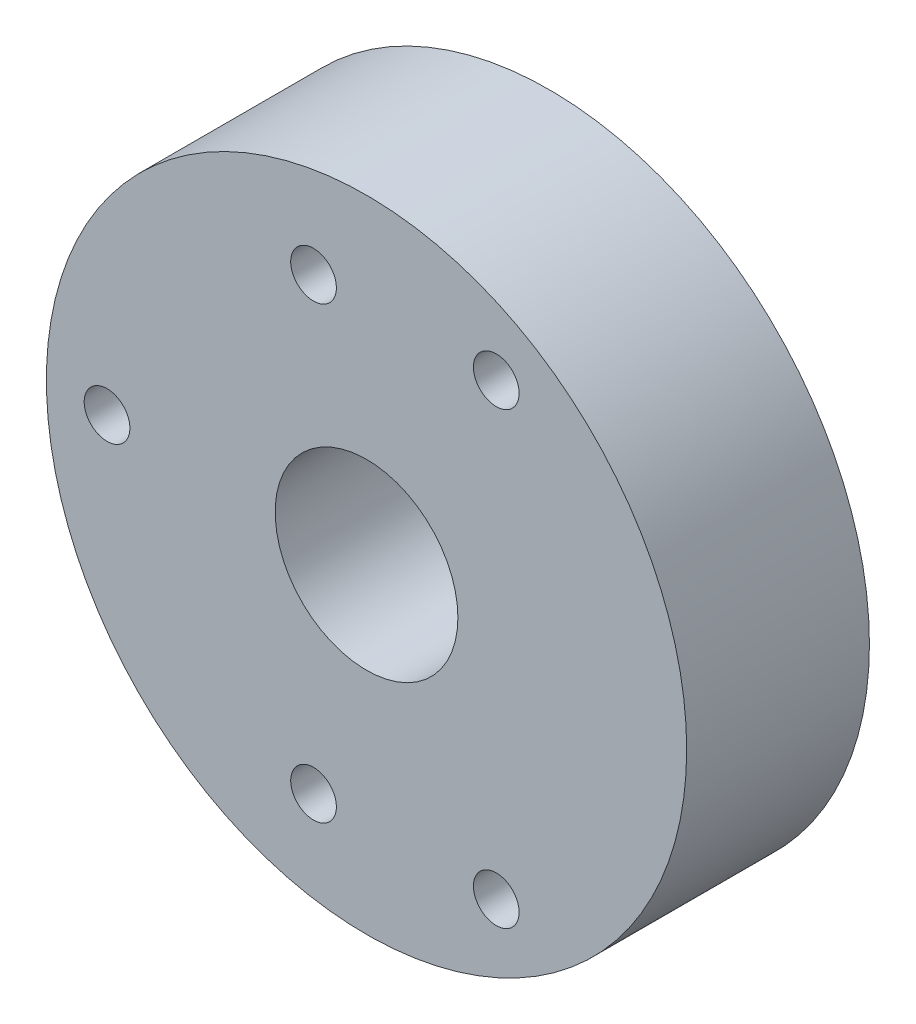
ISO-10303-21;
HEADER;
FILE_DESCRIPTION(('STEP AP214'),'2;1');
FILE_NAME('part.step','',(''),(''),'','','');
FILE_SCHEMA(('AUTOMOTIVE_DESIGN { 1 0 10303 214 1 1 1 1 }'));
ENDSEC;
DATA;
#1=APPLICATION_CONTEXT('core data for automotive mechanical design processes');
#2=APPLICATION_PROTOCOL_DEFINITION('international standard','automotive_design',2000,#1);
#3=PRODUCT_CONTEXT('',#1,'mechanical');
#4=PRODUCT('Part','Part','',(#3));
#5=PRODUCT_RELATED_PRODUCT_CATEGORY('part','',(#4));
#6=PRODUCT_DEFINITION_FORMATION('','',#4);
#7=PRODUCT_DEFINITION_CONTEXT('part definition',#1,'design');
#8=PRODUCT_DEFINITION('design','',#6,#7);
#9=PRODUCT_DEFINITION_SHAPE('','',#8);
#10=(LENGTH_UNIT() NAMED_UNIT(*) SI_UNIT(.MILLI.,.METRE.));
#11=(NAMED_UNIT(*) PLANE_ANGLE_UNIT() SI_UNIT($,.RADIAN.));
#12=(NAMED_UNIT(*) SI_UNIT($,.STERADIAN.) SOLID_ANGLE_UNIT());
#13=UNCERTAINTY_MEASURE_WITH_UNIT(LENGTH_MEASURE(1.E-05),#10,'distance_accuracy_value','');
#14=(GEOMETRIC_REPRESENTATION_CONTEXT(3) GLOBAL_UNCERTAINTY_ASSIGNED_CONTEXT((#13)) GLOBAL_UNIT_ASSIGNED_CONTEXT((#10,
#11,#12)) REPRESENTATION_CONTEXT('',''));
#15=CARTESIAN_POINT('',(0.,0.,0.));
#16=DIRECTION('',(0.,0.,1.));
#17=DIRECTION('',(1.,0.,0.));
#18=AXIS2_PLACEMENT_3D('',#15,#16,#17);
#19=CARTESIAN_POINT('',(0.,0.,25.4));
#20=DIRECTION('',(0.,0.,1.));
#21=DIRECTION('',(1.,0.,0.));
#22=AXIS2_PLACEMENT_3D('',#19,#20,#21);
#23=PLANE('',#22);
#24=CARTESIAN_POINT('',(-7.36599999999985,-31.235804263697,25.4));
#25=DIRECTION('',(0.,0.,1.));
#26=DIRECTION('',(1.,0.,0.));
#27=AXIS2_PLACEMENT_3D('',#24,#25,#26);
#28=CIRCLE('',#27,3.175);
#29=CARTESIAN_POINT('',(-4.19099999999985,-31.235804263697,25.4));
#30=VERTEX_POINT('',#29);
#31=EDGE_CURVE('E92',#30,#30,#28,.T.);
#32=ORIENTED_EDGE('',*,*,#31,.F.);
#33=EDGE_LOOP('',(#32));
#34=FACE_BOUND('',#33,.T.);
#35=CARTESIAN_POINT('',(-7.36599999999985,31.2358042636972,25.4));
#36=DIRECTION('',(0.,0.,1.));
#37=DIRECTION('',(1.,0.,0.));
#38=AXIS2_PLACEMENT_3D('',#35,#36,#37);
#39=CIRCLE('',#38,3.175);
#40=CARTESIAN_POINT('',(-4.19099999999985,31.2358042636972,25.4));
#41=VERTEX_POINT('',#40);
#42=EDGE_CURVE('E84',#41,#41,#39,.T.);
#43=ORIENTED_EDGE('',*,*,#42,.F.);
#44=EDGE_LOOP('',(#43));
#45=FACE_BOUND('',#44,.T.);
#46=CARTESIAN_POINT('',(18.0339999999997,31.2358042636973,25.4));
#47=DIRECTION('',(0.,0.,1.));
#48=DIRECTION('',(1.,0.,0.));
#49=AXIS2_PLACEMENT_3D('',#46,#47,#48);
#50=CIRCLE('',#49,3.175);
#51=CARTESIAN_POINT('',(21.2089999999997,31.2358042636973,25.4));
#52=VERTEX_POINT('',#51);
#53=EDGE_CURVE('E64',#52,#52,#50,.T.);
#54=ORIENTED_EDGE('',*,*,#53,.F.);
#55=EDGE_LOOP('',(#54));
#56=FACE_BOUND('',#55,.T.);
#57=CARTESIAN_POINT('',(0.,0.,25.4));
#58=DIRECTION('',(0.,0.,1.));
#59=DIRECTION('',(1.,0.,0.));
#60=AXIS2_PLACEMENT_3D('',#57,#58,#59);
#61=CIRCLE('',#60,12.7);
#62=CARTESIAN_POINT('',(12.7,0.,25.4));
#63=VERTEX_POINT('',#62);
#64=EDGE_CURVE('E50',#63,#63,#61,.T.);
#65=ORIENTED_EDGE('',*,*,#64,.F.);
#66=EDGE_LOOP('',(#65));
#67=FACE_BOUND('',#66,.T.);
#68=CARTESIAN_POINT('',(0.,0.,25.4));
#69=DIRECTION('',(0.,0.,1.));
#70=DIRECTION('',(1.,0.,0.));
#71=AXIS2_PLACEMENT_3D('',#68,#69,#70);
#72=CIRCLE('',#71,44.5002622140085);
#73=CARTESIAN_POINT('',(44.5002622140085,0.,25.4));
#74=VERTEX_POINT('',#73);
#75=EDGE_CURVE('E10',#74,#74,#72,.T.);
#76=ORIENTED_EDGE('',*,*,#75,.T.);
#77=EDGE_LOOP('',(#76));
#78=FACE_BOUND('',#77,.T.);
#79=CARTESIAN_POINT('',(-36.068,0.,25.4));
#80=DIRECTION('',(0.,0.,1.));
#81=DIRECTION('',(1.,0.,0.));
#82=AXIS2_PLACEMENT_3D('',#79,#80,#81);
#83=CIRCLE('',#82,3.175);
#84=CARTESIAN_POINT('',(-32.893,0.,25.4));
#85=VERTEX_POINT('',#84);
#86=EDGE_CURVE('E56',#85,#85,#83,.T.);
#87=ORIENTED_EDGE('',*,*,#86,.F.);
#88=EDGE_LOOP('',(#87));
#89=FACE_BOUND('',#88,.T.);
#90=CARTESIAN_POINT('',(18.0340000000001,-31.235804263697,25.4));
#91=DIRECTION('',(0.,0.,1.));
#92=DIRECTION('',(1.,0.,0.));
#93=AXIS2_PLACEMENT_3D('',#90,#91,#92);
#94=CIRCLE('',#93,3.175);
#95=CARTESIAN_POINT('',(21.2090000000001,-31.235804263697,25.4));
#96=VERTEX_POINT('',#95);
#97=EDGE_CURVE('E72',#96,#96,#94,.T.);
#98=ORIENTED_EDGE('',*,*,#97,.F.);
#99=EDGE_LOOP('',(#98));
#100=FACE_BOUND('',#99,.T.);
#101=ADVANCED_FACE('F37',(#34,#45,#56,#67,#78,#89,#100),#23,.T.);
#102=CARTESIAN_POINT('',(0.,0.,0.));
#103=DIRECTION('',(0.,0.,1.));
#104=DIRECTION('',(1.,0.,0.));
#105=AXIS2_PLACEMENT_3D('',#102,#103,#104);
#106=PLANE('',#105);
#107=CARTESIAN_POINT('',(-7.36599999999985,-31.235804263697,0.));
#108=DIRECTION('',(0.,0.,1.));
#109=DIRECTION('',(1.,0.,0.));
#110=AXIS2_PLACEMENT_3D('',#107,#108,#109);
#111=CIRCLE('',#110,3.175);
#112=CARTESIAN_POINT('',(-4.19099999999985,-31.235804263697,0.));
#113=VERTEX_POINT('',#112);
#114=EDGE_CURVE('E80',#113,#113,#111,.T.);
#115=ORIENTED_EDGE('',*,*,#114,.T.);
#116=EDGE_LOOP('',(#115));
#117=FACE_BOUND('',#116,.T.);
#118=CARTESIAN_POINT('',(-7.36599999999985,31.2358042636972,0.));
#119=DIRECTION('',(0.,0.,1.));
#120=DIRECTION('',(1.,0.,0.));
#121=AXIS2_PLACEMENT_3D('',#118,#119,#120);
#122=CIRCLE('',#121,3.175);
#123=CARTESIAN_POINT('',(-4.19099999999985,31.2358042636972,0.));
#124=VERTEX_POINT('',#123);
#125=EDGE_CURVE('E88',#124,#124,#122,.T.);
#126=ORIENTED_EDGE('',*,*,#125,.T.);
#127=EDGE_LOOP('',(#126));
#128=FACE_BOUND('',#127,.T.);
#129=CARTESIAN_POINT('',(0.,0.,0.));
#130=DIRECTION('',(0.,0.,1.));
#131=DIRECTION('',(1.,0.,0.));
#132=AXIS2_PLACEMENT_3D('',#129,#130,#131);
#133=CIRCLE('',#132,44.5002622140085);
#134=CARTESIAN_POINT('',(44.5002622140085,0.,0.));
#135=VERTEX_POINT('',#134);
#136=EDGE_CURVE('E41',#135,#135,#133,.T.);
#137=ORIENTED_EDGE('',*,*,#136,.F.);
#138=EDGE_LOOP('',(#137));
#139=FACE_BOUND('',#138,.T.);
#140=CARTESIAN_POINT('',(0.,0.,0.));
#141=DIRECTION('',(0.,0.,1.));
#142=DIRECTION('',(1.,0.,0.));
#143=AXIS2_PLACEMENT_3D('',#140,#141,#142);
#144=CIRCLE('',#143,12.7);
#145=CARTESIAN_POINT('',(12.7,0.,0.));
#146=VERTEX_POINT('',#145);
#147=EDGE_CURVE('E52',#146,#146,#144,.T.);
#148=ORIENTED_EDGE('',*,*,#147,.T.);
#149=EDGE_LOOP('',(#148));
#150=FACE_BOUND('',#149,.T.);
#151=CARTESIAN_POINT('',(-36.068,0.,0.));
#152=DIRECTION('',(0.,0.,1.));
#153=DIRECTION('',(1.,0.,0.));
#154=AXIS2_PLACEMENT_3D('',#151,#152,#153);
#155=CIRCLE('',#154,3.175);
#156=CARTESIAN_POINT('',(-32.893,0.,0.));
#157=VERTEX_POINT('',#156);
#158=EDGE_CURVE('E60',#157,#157,#155,.T.);
#159=ORIENTED_EDGE('',*,*,#158,.T.);
#160=EDGE_LOOP('',(#159));
#161=FACE_BOUND('',#160,.T.);
#162=CARTESIAN_POINT('',(18.0339999999997,31.2358042636973,0.));
#163=DIRECTION('',(0.,0.,1.));
#164=DIRECTION('',(1.,0.,0.));
#165=AXIS2_PLACEMENT_3D('',#162,#163,#164);
#166=CIRCLE('',#165,3.175);
#167=CARTESIAN_POINT('',(21.2089999999997,31.2358042636973,0.));
#168=VERTEX_POINT('',#167);
#169=EDGE_CURVE('E68',#168,#168,#166,.T.);
#170=ORIENTED_EDGE('',*,*,#169,.T.);
#171=EDGE_LOOP('',(#170));
#172=FACE_BOUND('',#171,.T.);
#173=CARTESIAN_POINT('',(18.0340000000001,-31.235804263697,0.));
#174=DIRECTION('',(0.,0.,1.));
#175=DIRECTION('',(1.,0.,0.));
#176=AXIS2_PLACEMENT_3D('',#173,#174,#175);
#177=CIRCLE('',#176,3.175);
#178=CARTESIAN_POINT('',(21.2090000000001,-31.235804263697,0.));
#179=VERTEX_POINT('',#178);
#180=EDGE_CURVE('E76',#179,#179,#177,.T.);
#181=ORIENTED_EDGE('',*,*,#180,.T.);
#182=EDGE_LOOP('',(#181));
#183=FACE_BOUND('',#182,.T.);
#184=ADVANCED_FACE('F100',(#117,#128,#139,#150,#161,#172,#183),#106,.F.);
#185=CARTESIAN_POINT('',(0.,0.,25.4));
#186=DIRECTION('',(0.,0.,-1.));
#187=DIRECTION('',(-1.,0.,0.));
#188=AXIS2_PLACEMENT_3D('',#185,#186,#187);
#189=CYLINDRICAL_SURFACE('',#188,44.5002622140085);
#190=ORIENTED_EDGE('',*,*,#75,.F.);
#191=EDGE_LOOP('',(#190));
#192=FACE_BOUND('',#191,.T.);
#193=ORIENTED_EDGE('',*,*,#136,.T.);
#194=EDGE_LOOP('',(#193));
#195=FACE_BOUND('',#194,.T.);
#196=ADVANCED_FACE('F39',(#192,#195),#189,.T.);
#197=CARTESIAN_POINT('',(0.,0.,25.4));
#198=DIRECTION('',(0.,0.,-1.));
#199=DIRECTION('',(-1.,0.,0.));
#200=AXIS2_PLACEMENT_3D('',#197,#198,#199);
#201=CYLINDRICAL_SURFACE('',#200,12.7);
#202=ORIENTED_EDGE('',*,*,#64,.T.);
#203=EDGE_LOOP('',(#202));
#204=FACE_BOUND('',#203,.T.);
#205=ORIENTED_EDGE('',*,*,#147,.F.);
#206=EDGE_LOOP('',(#205));
#207=FACE_BOUND('',#206,.T.);
#208=ADVANCED_FACE('F134',(#204,#207),#201,.F.);
#209=CARTESIAN_POINT('',(-36.068,0.,25.4));
#210=DIRECTION('',(0.,0.,-1.));
#211=DIRECTION('',(-1.,0.,0.));
#212=AXIS2_PLACEMENT_3D('',#209,#210,#211);
#213=CYLINDRICAL_SURFACE('',#212,3.175);
#214=ORIENTED_EDGE('',*,*,#86,.T.);
#215=EDGE_LOOP('',(#214));
#216=FACE_BOUND('',#215,.T.);
#217=ORIENTED_EDGE('',*,*,#158,.F.);
#218=EDGE_LOOP('',(#217));
#219=FACE_BOUND('',#218,.T.);
#220=ADVANCED_FACE('F139',(#216,#219),#213,.F.);
#221=CARTESIAN_POINT('',(18.0339999999997,31.2358042636973,25.4));
#222=DIRECTION('',(0.,0.,-1.));
#223=DIRECTION('',(-1.,0.,0.));
#224=AXIS2_PLACEMENT_3D('',#221,#222,#223);
#225=CYLINDRICAL_SURFACE('',#224,3.175);
#226=ORIENTED_EDGE('',*,*,#53,.T.);
#227=EDGE_LOOP('',(#226));
#228=FACE_BOUND('',#227,.T.);
#229=ORIENTED_EDGE('',*,*,#169,.F.);
#230=EDGE_LOOP('',(#229));
#231=FACE_BOUND('',#230,.T.);
#232=ADVANCED_FACE('F126',(#228,#231),#225,.F.);
#233=CARTESIAN_POINT('',(18.0340000000001,-31.235804263697,25.4));
#234=DIRECTION('',(0.,0.,-1.));
#235=DIRECTION('',(-1.,0.,0.));
#236=AXIS2_PLACEMENT_3D('',#233,#234,#235);
#237=CYLINDRICAL_SURFACE('',#236,3.175);
#238=ORIENTED_EDGE('',*,*,#97,.T.);
#239=EDGE_LOOP('',(#238));
#240=FACE_BOUND('',#239,.T.);
#241=ORIENTED_EDGE('',*,*,#180,.F.);
#242=EDGE_LOOP('',(#241));
#243=FACE_BOUND('',#242,.T.);
#244=ADVANCED_FACE('F123',(#240,#243),#237,.F.);
#245=CARTESIAN_POINT('',(-7.36599999999985,31.2358042636972,0.));
#246=DIRECTION('',(0.,0.,1.));
#247=DIRECTION('',(1.,0.,0.));
#248=AXIS2_PLACEMENT_3D('',#245,#246,#247);
#249=CYLINDRICAL_SURFACE('',#248,3.175);
#250=ORIENTED_EDGE('',*,*,#125,.F.);
#251=EDGE_LOOP('',(#250));
#252=FACE_BOUND('',#251,.T.);
#253=ORIENTED_EDGE('',*,*,#42,.T.);
#254=EDGE_LOOP('',(#253));
#255=FACE_BOUND('',#254,.T.);
#256=ADVANCED_FACE('F106',(#252,#255),#249,.F.);
#257=CARTESIAN_POINT('',(-7.36599999999985,-31.235804263697,0.));
#258=DIRECTION('',(0.,0.,1.));
#259=DIRECTION('',(1.,0.,0.));
#260=AXIS2_PLACEMENT_3D('',#257,#258,#259);
#261=CYLINDRICAL_SURFACE('',#260,3.175);
#262=ORIENTED_EDGE('',*,*,#114,.F.);
#263=EDGE_LOOP('',(#262));
#264=FACE_BOUND('',#263,.T.);
#265=ORIENTED_EDGE('',*,*,#31,.T.);
#266=EDGE_LOOP('',(#265));
#267=FACE_BOUND('',#266,.T.);
#268=ADVANCED_FACE('F103',(#264,#267),#261,.F.);
#269=CLOSED_SHELL('',(#101,#184,#196,#208,#220,#232,#244,#256,#268));
#270=MANIFOLD_SOLID_BREP('B2',#269);
#271=ADVANCED_BREP_SHAPE_REPRESENTATION('',(#18,#270),#14);
#272=SHAPE_DEFINITION_REPRESENTATION(#9,#271);
ENDSEC;
END-ISO-10303-21;
